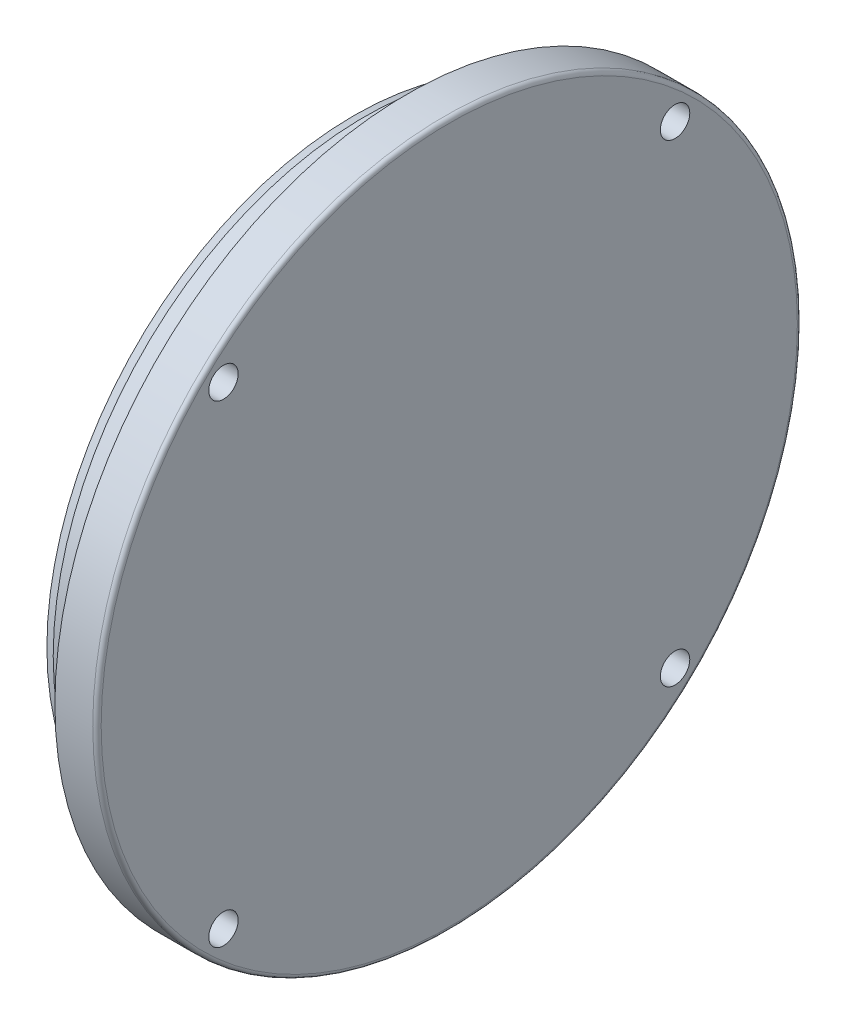
ISO-10303-21;
HEADER;
FILE_DESCRIPTION(('STEP AP214'),'2;1');
FILE_NAME('part.step','',(''),(''),'','','');
FILE_SCHEMA(('AUTOMOTIVE_DESIGN { 1 0 10303 214 1 1 1 1 }'));
ENDSEC;
DATA;
#1=APPLICATION_CONTEXT('core data for automotive mechanical design processes');
#2=APPLICATION_PROTOCOL_DEFINITION('international standard','automotive_design',2000,#1);
#3=PRODUCT_CONTEXT('',#1,'mechanical');
#4=PRODUCT('Part','Part','',(#3));
#5=PRODUCT_RELATED_PRODUCT_CATEGORY('part','',(#4));
#6=PRODUCT_DEFINITION_FORMATION('','',#4);
#7=PRODUCT_DEFINITION_CONTEXT('part definition',#1,'design');
#8=PRODUCT_DEFINITION('design','',#6,#7);
#9=PRODUCT_DEFINITION_SHAPE('','',#8);
#10=(LENGTH_UNIT() NAMED_UNIT(*) SI_UNIT(.MILLI.,.METRE.));
#11=(NAMED_UNIT(*) PLANE_ANGLE_UNIT() SI_UNIT($,.RADIAN.));
#12=(NAMED_UNIT(*) SI_UNIT($,.STERADIAN.) SOLID_ANGLE_UNIT());
#13=UNCERTAINTY_MEASURE_WITH_UNIT(LENGTH_MEASURE(1.E-05),#10,'distance_accuracy_value','');
#14=(GEOMETRIC_REPRESENTATION_CONTEXT(3) GLOBAL_UNCERTAINTY_ASSIGNED_CONTEXT((#13)) GLOBAL_UNIT_ASSIGNED_CONTEXT((#10,
#11,#12)) REPRESENTATION_CONTEXT('',''));
#15=CARTESIAN_POINT('',(0.,0.,0.));
#16=DIRECTION('',(0.,0.,1.));
#17=DIRECTION('',(1.,0.,0.));
#18=AXIS2_PLACEMENT_3D('',#15,#16,#17);
#19=CARTESIAN_POINT('',(13.9862915010152,112.5,107.349895202557));
#20=DIRECTION('',(1.,0.,0.));
#21=DIRECTION('',(0.,0.,-1.));
#22=AXIS2_PLACEMENT_3D('',#19,#20,#21);
#23=CYLINDRICAL_SURFACE('',#22,4.00000000000001);
#24=CARTESIAN_POINT('',(25.3,112.5,107.349895202557));
#25=DIRECTION('',(1.,0.,0.));
#26=DIRECTION('',(0.,0.,-1.));
#27=AXIS2_PLACEMENT_3D('',#24,#25,#26);
#28=CIRCLE('',#27,4.00000000000001);
#29=CARTESIAN_POINT('',(25.3,112.5,103.349895202557));
#30=VERTEX_POINT('',#29);
#31=EDGE_CURVE('E95',#30,#30,#28,.F.);
#32=ORIENTED_EDGE('',*,*,#31,.T.);
#33=EDGE_LOOP('',(#32));
#34=FACE_BOUND('',#33,.T.);
#35=CARTESIAN_POINT('',(35.3,112.5,107.349895202557));
#36=DIRECTION('',(1.,0.,0.));
#37=DIRECTION('',(0.,0.,-1.));
#38=AXIS2_PLACEMENT_3D('',#35,#36,#37);
#39=CIRCLE('',#38,4.00000000000001);
#40=CARTESIAN_POINT('',(35.3,112.5,103.349895202557));
#41=VERTEX_POINT('',#40);
#42=EDGE_CURVE('E49',#41,#41,#39,.F.);
#43=ORIENTED_EDGE('',*,*,#42,.F.);
#44=EDGE_LOOP('',(#43));
#45=FACE_BOUND('',#44,.T.);
#46=ADVANCED_FACE('F31',(#34,#45),#23,.F.);
#47=CARTESIAN_POINT('',(13.9862915010152,112.5,-107.349895202557));
#48=DIRECTION('',(1.,0.,0.));
#49=DIRECTION('',(0.,0.,-1.));
#50=AXIS2_PLACEMENT_3D('',#47,#48,#49);
#51=CYLINDRICAL_SURFACE('',#50,4.00000000000001);
#52=CARTESIAN_POINT('',(25.3,112.5,-107.349895202557));
#53=DIRECTION('',(1.,0.,0.));
#54=DIRECTION('',(0.,0.,-1.));
#55=AXIS2_PLACEMENT_3D('',#52,#53,#54);
#56=CIRCLE('',#55,4.00000000000001);
#57=CARTESIAN_POINT('',(25.3,112.5,-111.349895202557));
#58=VERTEX_POINT('',#57);
#59=EDGE_CURVE('E98',#58,#58,#56,.F.);
#60=ORIENTED_EDGE('',*,*,#59,.T.);
#61=EDGE_LOOP('',(#60));
#62=FACE_BOUND('',#61,.T.);
#63=CARTESIAN_POINT('',(35.3,112.5,-107.349895202557));
#64=DIRECTION('',(1.,0.,0.));
#65=DIRECTION('',(0.,0.,-1.));
#66=AXIS2_PLACEMENT_3D('',#63,#64,#65);
#67=CIRCLE('',#66,4.00000000000001);
#68=CARTESIAN_POINT('',(35.3,112.5,-111.349895202557));
#69=VERTEX_POINT('',#68);
#70=EDGE_CURVE('E53',#69,#69,#67,.F.);
#71=ORIENTED_EDGE('',*,*,#70,.F.);
#72=EDGE_LOOP('',(#71));
#73=FACE_BOUND('',#72,.T.);
#74=ADVANCED_FACE('F162',(#62,#73),#51,.F.);
#75=CARTESIAN_POINT('',(13.9862915010152,-112.5,-107.349895202557));
#76=DIRECTION('',(1.,0.,0.));
#77=DIRECTION('',(0.,0.,-1.));
#78=AXIS2_PLACEMENT_3D('',#75,#76,#77);
#79=CYLINDRICAL_SURFACE('',#78,4.00000000000001);
#80=CARTESIAN_POINT('',(25.3,-112.5,-107.349895202557));
#81=DIRECTION('',(1.,0.,0.));
#82=DIRECTION('',(0.,0.,-1.));
#83=AXIS2_PLACEMENT_3D('',#80,#81,#82);
#84=CIRCLE('',#83,4.00000000000001);
#85=CARTESIAN_POINT('',(25.3,-112.5,-111.349895202557));
#86=VERTEX_POINT('',#85);
#87=EDGE_CURVE('E101',#86,#86,#84,.F.);
#88=ORIENTED_EDGE('',*,*,#87,.T.);
#89=EDGE_LOOP('',(#88));
#90=FACE_BOUND('',#89,.T.);
#91=CARTESIAN_POINT('',(35.3,-112.5,-107.349895202557));
#92=DIRECTION('',(1.,0.,0.));
#93=DIRECTION('',(0.,0.,-1.));
#94=AXIS2_PLACEMENT_3D('',#91,#92,#93);
#95=CIRCLE('',#94,4.00000000000001);
#96=CARTESIAN_POINT('',(35.3,-112.5,-111.349895202557));
#97=VERTEX_POINT('',#96);
#98=EDGE_CURVE('E56',#97,#97,#95,.F.);
#99=ORIENTED_EDGE('',*,*,#98,.F.);
#100=EDGE_LOOP('',(#99));
#101=FACE_BOUND('',#100,.T.);
#102=ADVANCED_FACE('F168',(#90,#101),#79,.F.);
#103=CARTESIAN_POINT('',(13.9862915010152,-112.5,107.349895202557));
#104=DIRECTION('',(1.,0.,0.));
#105=DIRECTION('',(0.,0.,-1.));
#106=AXIS2_PLACEMENT_3D('',#103,#104,#105);
#107=CYLINDRICAL_SURFACE('',#106,4.00000000000001);
#108=CARTESIAN_POINT('',(25.3,-112.5,107.349895202557));
#109=DIRECTION('',(1.,0.,0.));
#110=DIRECTION('',(0.,0.,-1.));
#111=AXIS2_PLACEMENT_3D('',#108,#109,#110);
#112=CIRCLE('',#111,4.00000000000001);
#113=CARTESIAN_POINT('',(25.3,-112.5,103.349895202557));
#114=VERTEX_POINT('',#113);
#115=EDGE_CURVE('E52',#114,#114,#112,.F.);
#116=ORIENTED_EDGE('',*,*,#115,.T.);
#117=EDGE_LOOP('',(#116));
#118=FACE_BOUND('',#117,.T.);
#119=CARTESIAN_POINT('',(35.3,-112.5,107.349895202557));
#120=DIRECTION('',(1.,0.,0.));
#121=DIRECTION('',(0.,0.,-1.));
#122=AXIS2_PLACEMENT_3D('',#119,#120,#121);
#123=CIRCLE('',#122,4.00000000000001);
#124=CARTESIAN_POINT('',(35.3,-112.5,103.349895202557));
#125=VERTEX_POINT('',#124);
#126=EDGE_CURVE('E59',#125,#125,#123,.F.);
#127=ORIENTED_EDGE('',*,*,#126,.F.);
#128=EDGE_LOOP('',(#127));
#129=FACE_BOUND('',#128,.T.);
#130=ADVANCED_FACE('F173',(#118,#129),#107,.F.);
#131=CARTESIAN_POINT('',(5.,32.75,0.));
#132=DIRECTION('',(-1.,0.,0.));
#133=DIRECTION('',(0.,0.,1.));
#134=AXIS2_PLACEMENT_3D('',#131,#132,#133);
#135=PLANE('',#134);
#136=CARTESIAN_POINT('',(5.,0.,0.));
#137=DIRECTION('',(-1.,0.,0.));
#138=DIRECTION('',(0.,0.,1.));
#139=AXIS2_PLACEMENT_3D('',#136,#137,#138);
#140=CIRCLE('',#139,32.75);
#141=CARTESIAN_POINT('',(5.,0.,32.75));
#142=VERTEX_POINT('',#141);
#143=EDGE_CURVE('E42',#142,#142,#140,.T.);
#144=ORIENTED_EDGE('',*,*,#143,.F.);
#145=EDGE_LOOP('',(#144));
#146=FACE_BOUND('',#145,.T.);
#147=CARTESIAN_POINT('',(5.,0.,0.));
#148=DIRECTION('',(-1.,0.,0.));
#149=DIRECTION('',(0.,0.,1.));
#150=AXIS2_PLACEMENT_3D('',#147,#148,#149);
#151=CIRCLE('',#150,31.);
#152=CARTESIAN_POINT('',(5.,0.,31.));
#153=VERTEX_POINT('',#152);
#154=EDGE_CURVE('E92',#153,#153,#151,.T.);
#155=ORIENTED_EDGE('',*,*,#154,.T.);
#156=EDGE_LOOP('',(#155));
#157=FACE_BOUND('',#156,.T.);
#158=ADVANCED_FACE('F219',(#146,#157),#135,.F.);
#159=CARTESIAN_POINT('',(0.,0.,0.));
#160=DIRECTION('',(-1.,0.,0.));
#161=DIRECTION('',(0.,0.,1.));
#162=AXIS2_PLACEMENT_3D('',#159,#160,#161);
#163=CYLINDRICAL_SURFACE('',#162,32.75);
#164=CARTESIAN_POINT('',(7.3,0.,0.));
#165=DIRECTION('',(-1.,0.,0.));
#166=DIRECTION('',(0.,0.,1.));
#167=AXIS2_PLACEMENT_3D('',#164,#165,#166);
#168=CIRCLE('',#167,32.75);
#169=CARTESIAN_POINT('',(7.3,0.,32.75));
#170=VERTEX_POINT('',#169);
#171=EDGE_CURVE('E46',#170,#170,#168,.T.);
#172=ORIENTED_EDGE('',*,*,#171,.F.);
#173=EDGE_LOOP('',(#172));
#174=FACE_BOUND('',#173,.T.);
#175=ORIENTED_EDGE('',*,*,#143,.T.);
#176=EDGE_LOOP('',(#175));
#177=FACE_BOUND('',#176,.T.);
#178=ADVANCED_FACE('F216',(#174,#177),#163,.F.);
#179=CARTESIAN_POINT('',(7.3,32.75,0.));
#180=DIRECTION('',(1.,0.,0.));
#181=DIRECTION('',(0.,0.,-1.));
#182=AXIS2_PLACEMENT_3D('',#179,#180,#181);
#183=PLANE('',#182);
#184=CARTESIAN_POINT('',(7.3,0.,0.));
#185=DIRECTION('',(-1.,0.,0.));
#186=DIRECTION('',(0.,0.,1.));
#187=AXIS2_PLACEMENT_3D('',#184,#185,#186);
#188=CIRCLE('',#187,31.);
#189=CARTESIAN_POINT('',(7.3,0.,31.));
#190=VERTEX_POINT('',#189);
#191=EDGE_CURVE('E65',#190,#190,#188,.T.);
#192=ORIENTED_EDGE('',*,*,#191,.F.);
#193=EDGE_LOOP('',(#192));
#194=FACE_BOUND('',#193,.T.);
#195=ORIENTED_EDGE('',*,*,#171,.T.);
#196=EDGE_LOOP('',(#195));
#197=FACE_BOUND('',#196,.T.);
#198=ADVANCED_FACE('F212',(#194,#197),#183,.F.);
#199=CARTESIAN_POINT('',(0.,0.,0.));
#200=DIRECTION('',(-1.,0.,0.));
#201=DIRECTION('',(0.,0.,1.));
#202=AXIS2_PLACEMENT_3D('',#199,#200,#201);
#203=CYLINDRICAL_SURFACE('',#202,31.);
#204=CARTESIAN_POINT('',(25.3,0.,0.));
#205=DIRECTION('',(-1.,0.,0.));
#206=DIRECTION('',(0.,0.,1.));
#207=AXIS2_PLACEMENT_3D('',#204,#205,#206);
#208=CIRCLE('',#207,31.);
#209=CARTESIAN_POINT('',(25.3,0.,31.));
#210=VERTEX_POINT('',#209);
#211=EDGE_CURVE('E68',#210,#210,#208,.T.);
#212=ORIENTED_EDGE('',*,*,#211,.F.);
#213=EDGE_LOOP('',(#212));
#214=FACE_BOUND('',#213,.T.);
#215=ORIENTED_EDGE('',*,*,#191,.T.);
#216=EDGE_LOOP('',(#215));
#217=FACE_BOUND('',#216,.T.);
#218=ADVANCED_FACE('F208',(#214,#217),#203,.F.);
#219=CARTESIAN_POINT('',(25.3,31.,0.));
#220=DIRECTION('',(1.,0.,0.));
#221=DIRECTION('',(0.,0.,-1.));
#222=AXIS2_PLACEMENT_3D('',#219,#220,#221);
#223=PLANE('',#222);
#224=CARTESIAN_POINT('',(25.3,0.,0.));
#225=DIRECTION('',(-1.,0.,0.));
#226=DIRECTION('',(0.,0.,1.));
#227=AXIS2_PLACEMENT_3D('',#224,#225,#226);
#228=CIRCLE('',#227,16.);
#229=CARTESIAN_POINT('',(25.3,0.,16.));
#230=VERTEX_POINT('',#229);
#231=EDGE_CURVE('E71',#230,#230,#228,.T.);
#232=ORIENTED_EDGE('',*,*,#231,.F.);
#233=EDGE_LOOP('',(#232));
#234=FACE_BOUND('',#233,.T.);
#235=ORIENTED_EDGE('',*,*,#211,.T.);
#236=EDGE_LOOP('',(#235));
#237=FACE_BOUND('',#236,.T.);
#238=ADVANCED_FACE('F204',(#234,#237),#223,.F.);
#239=CARTESIAN_POINT('',(0.,0.,0.));
#240=DIRECTION('',(-1.,0.,0.));
#241=DIRECTION('',(0.,0.,1.));
#242=AXIS2_PLACEMENT_3D('',#239,#240,#241);
#243=CYLINDRICAL_SURFACE('',#242,16.);
#244=CARTESIAN_POINT('',(35.3,0.,0.));
#245=DIRECTION('',(-1.,0.,0.));
#246=DIRECTION('',(0.,0.,1.));
#247=AXIS2_PLACEMENT_3D('',#244,#245,#246);
#248=CIRCLE('',#247,16.);
#249=CARTESIAN_POINT('',(35.3,0.,16.));
#250=VERTEX_POINT('',#249);
#251=EDGE_CURVE('E74',#250,#250,#248,.T.);
#252=ORIENTED_EDGE('',*,*,#251,.F.);
#253=EDGE_LOOP('',(#252));
#254=FACE_BOUND('',#253,.T.);
#255=ORIENTED_EDGE('',*,*,#231,.T.);
#256=EDGE_LOOP('',(#255));
#257=FACE_BOUND('',#256,.T.);
#258=ADVANCED_FACE('F200',(#254,#257),#243,.F.);
#259=CARTESIAN_POINT('',(35.3,16.,0.));
#260=DIRECTION('',(1.,0.,0.));
#261=DIRECTION('',(0.,0.,-1.));
#262=AXIS2_PLACEMENT_3D('',#259,#260,#261);
#263=PLANE('',#262);
#264=ORIENTED_EDGE('',*,*,#251,.T.);
#265=EDGE_LOOP('',(#264));
#266=FACE_BOUND('',#265,.T.);
#267=ADVANCED_FACE('F144',(#266),#263,.F.);
#268=CARTESIAN_POINT('',(45.3,161.,0.));
#269=DIRECTION('',(-1.,0.,0.));
#270=DIRECTION('',(0.,0.,1.));
#271=AXIS2_PLACEMENT_3D('',#268,#269,#270);
#272=PLANE('',#271);
#273=CARTESIAN_POINT('',(45.3,0.,0.));
#274=DIRECTION('',(-1.,0.,0.));
#275=DIRECTION('',(0.,0.,1.));
#276=AXIS2_PLACEMENT_3D('',#273,#274,#275);
#277=CIRCLE('',#276,165.5);
#278=CARTESIAN_POINT('',(45.3,0.,165.5));
#279=VERTEX_POINT('',#278);
#280=EDGE_CURVE('E10',#279,#279,#277,.F.);
#281=ORIENTED_EDGE('',*,*,#280,.T.);
#282=EDGE_LOOP('',(#281));
#283=FACE_BOUND('',#282,.T.);
#284=CARTESIAN_POINT('',(45.3,-112.5,107.349895202557));
#285=DIRECTION('',(1.,0.,0.));
#286=DIRECTION('',(0.,0.,-1.));
#287=AXIS2_PLACEMENT_3D('',#284,#285,#286);
#288=CIRCLE('',#287,7.);
#289=CARTESIAN_POINT('',(45.3,-112.5,100.349895202557));
#290=VERTEX_POINT('',#289);
#291=EDGE_CURVE('E112',#290,#290,#288,.T.);
#292=ORIENTED_EDGE('',*,*,#291,.F.);
#293=EDGE_LOOP('',(#292));
#294=FACE_BOUND('',#293,.T.);
#295=CARTESIAN_POINT('',(45.3,-112.5,-107.349895202557));
#296=DIRECTION('',(1.,0.,0.));
#297=DIRECTION('',(0.,0.,-1.));
#298=AXIS2_PLACEMENT_3D('',#295,#296,#297);
#299=CIRCLE('',#298,7.);
#300=CARTESIAN_POINT('',(45.3,-112.5,-114.349895202557));
#301=VERTEX_POINT('',#300);
#302=EDGE_CURVE('E118',#301,#301,#299,.T.);
#303=ORIENTED_EDGE('',*,*,#302,.F.);
#304=EDGE_LOOP('',(#303));
#305=FACE_BOUND('',#304,.T.);
#306=CARTESIAN_POINT('',(45.3,112.5,-107.349895202557));
#307=DIRECTION('',(1.,0.,0.));
#308=DIRECTION('',(0.,0.,-1.));
#309=AXIS2_PLACEMENT_3D('',#306,#307,#308);
#310=CIRCLE('',#309,7.);
#311=CARTESIAN_POINT('',(45.3,112.5,-114.349895202557));
#312=VERTEX_POINT('',#311);
#313=EDGE_CURVE('E124',#312,#312,#310,.T.);
#314=ORIENTED_EDGE('',*,*,#313,.F.);
#315=EDGE_LOOP('',(#314));
#316=FACE_BOUND('',#315,.T.);
#317=CARTESIAN_POINT('',(45.3,112.5,107.349895202557));
#318=DIRECTION('',(1.,0.,0.));
#319=DIRECTION('',(0.,0.,-1.));
#320=AXIS2_PLACEMENT_3D('',#317,#318,#319);
#321=CIRCLE('',#320,7.);
#322=CARTESIAN_POINT('',(45.3,112.5,100.349895202557));
#323=VERTEX_POINT('',#322);
#324=EDGE_CURVE('E106',#323,#323,#321,.T.);
#325=ORIENTED_EDGE('',*,*,#324,.F.);
#326=EDGE_LOOP('',(#325));
#327=FACE_BOUND('',#326,.T.);
#328=ADVANCED_FACE('F140',(#283,#294,#305,#316,#327),#272,.F.);
#329=CARTESIAN_POINT('',(0.,0.,0.));
#330=DIRECTION('',(-1.,0.,0.));
#331=DIRECTION('',(0.,0.,1.));
#332=AXIS2_PLACEMENT_3D('',#329,#330,#331);
#333=CYLINDRICAL_SURFACE('',#332,167.5);
#334=CARTESIAN_POINT('',(43.3,0.,0.));
#335=DIRECTION('',(-1.,0.,0.));
#336=DIRECTION('',(0.,0.,1.));
#337=AXIS2_PLACEMENT_3D('',#334,#335,#336);
#338=CIRCLE('',#337,167.5);
#339=CARTESIAN_POINT('',(43.3,0.,167.5));
#340=VERTEX_POINT('',#339);
#341=EDGE_CURVE('E38',#340,#340,#338,.T.);
#342=ORIENTED_EDGE('',*,*,#341,.T.);
#343=EDGE_LOOP('',(#342));
#344=FACE_BOUND('',#343,.T.);
#345=CARTESIAN_POINT('',(25.3,0.,0.));
#346=DIRECTION('',(-1.,0.,0.));
#347=DIRECTION('',(0.,0.,1.));
#348=AXIS2_PLACEMENT_3D('',#345,#346,#347);
#349=CIRCLE('',#348,167.5);
#350=CARTESIAN_POINT('',(25.3,0.,167.5));
#351=VERTEX_POINT('',#350);
#352=EDGE_CURVE('E77',#351,#351,#349,.T.);
#353=ORIENTED_EDGE('',*,*,#352,.F.);
#354=EDGE_LOOP('',(#353));
#355=FACE_BOUND('',#354,.T.);
#356=ADVANCED_FACE('F143',(#344,#355),#333,.T.);
#357=CARTESIAN_POINT('',(25.3,167.5,0.));
#358=DIRECTION('',(1.,0.,0.));
#359=DIRECTION('',(0.,0.,-1.));
#360=AXIS2_PLACEMENT_3D('',#357,#358,#359);
#361=PLANE('',#360);
#362=ORIENTED_EDGE('',*,*,#115,.F.);
#363=EDGE_LOOP('',(#362));
#364=FACE_BOUND('',#363,.T.);
#365=ORIENTED_EDGE('',*,*,#87,.F.);
#366=EDGE_LOOP('',(#365));
#367=FACE_BOUND('',#366,.T.);
#368=ORIENTED_EDGE('',*,*,#59,.F.);
#369=EDGE_LOOP('',(#368));
#370=FACE_BOUND('',#369,.T.);
#371=ORIENTED_EDGE('',*,*,#31,.F.);
#372=EDGE_LOOP('',(#371));
#373=FACE_BOUND('',#372,.T.);
#374=CARTESIAN_POINT('',(25.3,0.,0.));
#375=DIRECTION('',(-1.,0.,0.));
#376=DIRECTION('',(0.,0.,1.));
#377=AXIS2_PLACEMENT_3D('',#374,#375,#376);
#378=CIRCLE('',#377,148.);
#379=CARTESIAN_POINT('',(25.3,0.,148.));
#380=VERTEX_POINT('',#379);
#381=EDGE_CURVE('E80',#380,#380,#378,.T.);
#382=ORIENTED_EDGE('',*,*,#381,.F.);
#383=EDGE_LOOP('',(#382));
#384=FACE_BOUND('',#383,.T.);
#385=ORIENTED_EDGE('',*,*,#352,.T.);
#386=EDGE_LOOP('',(#385));
#387=FACE_BOUND('',#386,.T.);
#388=ADVANCED_FACE('F191',(#364,#367,#370,#373,#384,#387),#361,.F.);
#389=CARTESIAN_POINT('',(0.,0.,0.));
#390=DIRECTION('',(-1.,0.,0.));
#391=DIRECTION('',(0.,0.,1.));
#392=AXIS2_PLACEMENT_3D('',#389,#390,#391);
#393=CYLINDRICAL_SURFACE('',#392,148.);
#394=CARTESIAN_POINT('',(5.,0.,0.));
#395=DIRECTION('',(-1.,0.,0.));
#396=DIRECTION('',(0.,0.,1.));
#397=AXIS2_PLACEMENT_3D('',#394,#395,#396);
#398=CIRCLE('',#397,148.);
#399=CARTESIAN_POINT('',(5.,0.,148.));
#400=VERTEX_POINT('',#399);
#401=EDGE_CURVE('E83',#400,#400,#398,.T.);
#402=ORIENTED_EDGE('',*,*,#401,.F.);
#403=EDGE_LOOP('',(#402));
#404=FACE_BOUND('',#403,.T.);
#405=ORIENTED_EDGE('',*,*,#381,.T.);
#406=EDGE_LOOP('',(#405));
#407=FACE_BOUND('',#406,.T.);
#408=ADVANCED_FACE('F187',(#404,#407),#393,.T.);
#409=CARTESIAN_POINT('',(5.,0.,0.));
#410=DIRECTION('',(1.,0.,0.));
#411=DIRECTION('',(0.,0.,-1.));
#412=AXIS2_PLACEMENT_3D('',#409,#410,#411);
#413=CONICAL_SURFACE('',#412,148.,0.380506377112365);
#414=CARTESIAN_POINT('',(0.,0.,0.));
#415=DIRECTION('',(-1.,0.,0.));
#416=DIRECTION('',(0.,0.,1.));
#417=AXIS2_PLACEMENT_3D('',#414,#415,#416);
#418=CIRCLE('',#417,146.);
#419=CARTESIAN_POINT('',(0.,0.,146.));
#420=VERTEX_POINT('',#419);
#421=EDGE_CURVE('E86',#420,#420,#418,.T.);
#422=ORIENTED_EDGE('',*,*,#421,.F.);
#423=EDGE_LOOP('',(#422));
#424=FACE_BOUND('',#423,.T.);
#425=ORIENTED_EDGE('',*,*,#401,.T.);
#426=EDGE_LOOP('',(#425));
#427=FACE_BOUND('',#426,.T.);
#428=ADVANCED_FACE('F183',(#424,#427),#413,.T.);
#429=CARTESIAN_POINT('',(0.,31.,0.));
#430=DIRECTION('',(1.,0.,0.));
#431=DIRECTION('',(0.,0.,-1.));
#432=AXIS2_PLACEMENT_3D('',#429,#430,#431);
#433=PLANE('',#432);
#434=CARTESIAN_POINT('',(0.,0.,0.));
#435=DIRECTION('',(-1.,0.,0.));
#436=DIRECTION('',(0.,0.,1.));
#437=AXIS2_PLACEMENT_3D('',#434,#435,#436);
#438=CIRCLE('',#437,31.);
#439=CARTESIAN_POINT('',(0.,0.,31.));
#440=VERTEX_POINT('',#439);
#441=EDGE_CURVE('E89',#440,#440,#438,.T.);
#442=ORIENTED_EDGE('',*,*,#441,.F.);
#443=EDGE_LOOP('',(#442));
#444=FACE_BOUND('',#443,.T.);
#445=ORIENTED_EDGE('',*,*,#421,.T.);
#446=EDGE_LOOP('',(#445));
#447=FACE_BOUND('',#446,.T.);
#448=ADVANCED_FACE('F179',(#444,#447),#433,.F.);
#449=CARTESIAN_POINT('',(0.,0.,0.));
#450=DIRECTION('',(-1.,0.,0.));
#451=DIRECTION('',(0.,0.,1.));
#452=AXIS2_PLACEMENT_3D('',#449,#450,#451);
#453=CYLINDRICAL_SURFACE('',#452,31.);
#454=ORIENTED_EDGE('',*,*,#154,.F.);
#455=EDGE_LOOP('',(#454));
#456=FACE_BOUND('',#455,.T.);
#457=ORIENTED_EDGE('',*,*,#441,.T.);
#458=EDGE_LOOP('',(#457));
#459=FACE_BOUND('',#458,.T.);
#460=ADVANCED_FACE('F175',(#456,#459),#453,.F.);
#461=CARTESIAN_POINT('',(35.3,-112.5,107.349895202557));
#462=DIRECTION('',(1.,0.,0.));
#463=DIRECTION('',(0.,0.,-1.));
#464=AXIS2_PLACEMENT_3D('',#461,#462,#463);
#465=PLANE('',#464);
#466=CARTESIAN_POINT('',(35.3,-112.5,107.349895202557));
#467=DIRECTION('',(1.,0.,0.));
#468=DIRECTION('',(0.,0.,-1.));
#469=AXIS2_PLACEMENT_3D('',#466,#467,#468);
#470=CIRCLE('',#469,7.);
#471=CARTESIAN_POINT('',(35.3,-112.5,100.349895202557));
#472=VERTEX_POINT('',#471);
#473=EDGE_CURVE('E115',#472,#472,#470,.T.);
#474=ORIENTED_EDGE('',*,*,#473,.T.);
#475=EDGE_LOOP('',(#474));
#476=FACE_BOUND('',#475,.T.);
#477=ORIENTED_EDGE('',*,*,#126,.T.);
#478=EDGE_LOOP('',(#477));
#479=FACE_BOUND('',#478,.T.);
#480=ADVANCED_FACE('F178',(#476,#479),#465,.T.);
#481=CARTESIAN_POINT('',(35.3,-112.5,107.349895202557));
#482=DIRECTION('',(1.,0.,0.));
#483=DIRECTION('',(0.,0.,-1.));
#484=AXIS2_PLACEMENT_3D('',#481,#482,#483);
#485=CYLINDRICAL_SURFACE('',#484,7.);
#486=ORIENTED_EDGE('',*,*,#473,.F.);
#487=EDGE_LOOP('',(#486));
#488=FACE_BOUND('',#487,.T.);
#489=ORIENTED_EDGE('',*,*,#291,.T.);
#490=EDGE_LOOP('',(#489));
#491=FACE_BOUND('',#490,.T.);
#492=ADVANCED_FACE('F252',(#488,#491),#485,.F.);
#493=CARTESIAN_POINT('',(35.3,-112.5,-107.349895202557));
#494=DIRECTION('',(1.,0.,0.));
#495=DIRECTION('',(0.,0.,-1.));
#496=AXIS2_PLACEMENT_3D('',#493,#494,#495);
#497=PLANE('',#496);
#498=CARTESIAN_POINT('',(35.3,-112.5,-107.349895202557));
#499=DIRECTION('',(1.,0.,0.));
#500=DIRECTION('',(0.,0.,-1.));
#501=AXIS2_PLACEMENT_3D('',#498,#499,#500);
#502=CIRCLE('',#501,7.);
#503=CARTESIAN_POINT('',(35.3,-112.5,-114.349895202557));
#504=VERTEX_POINT('',#503);
#505=EDGE_CURVE('E121',#504,#504,#502,.T.);
#506=ORIENTED_EDGE('',*,*,#505,.T.);
#507=EDGE_LOOP('',(#506));
#508=FACE_BOUND('',#507,.T.);
#509=ORIENTED_EDGE('',*,*,#98,.T.);
#510=EDGE_LOOP('',(#509));
#511=FACE_BOUND('',#510,.T.);
#512=ADVANCED_FACE('F258',(#508,#511),#497,.T.);
#513=CARTESIAN_POINT('',(35.3,-112.5,-107.349895202557));
#514=DIRECTION('',(1.,0.,0.));
#515=DIRECTION('',(0.,0.,-1.));
#516=AXIS2_PLACEMENT_3D('',#513,#514,#515);
#517=CYLINDRICAL_SURFACE('',#516,7.);
#518=ORIENTED_EDGE('',*,*,#505,.F.);
#519=EDGE_LOOP('',(#518));
#520=FACE_BOUND('',#519,.T.);
#521=ORIENTED_EDGE('',*,*,#302,.T.);
#522=EDGE_LOOP('',(#521));
#523=FACE_BOUND('',#522,.T.);
#524=ADVANCED_FACE('F262',(#520,#523),#517,.F.);
#525=CARTESIAN_POINT('',(35.3,112.5,-107.349895202557));
#526=DIRECTION('',(1.,0.,0.));
#527=DIRECTION('',(0.,0.,-1.));
#528=AXIS2_PLACEMENT_3D('',#525,#526,#527);
#529=PLANE('',#528);
#530=CARTESIAN_POINT('',(35.3,112.5,-107.349895202557));
#531=DIRECTION('',(1.,0.,0.));
#532=DIRECTION('',(0.,0.,-1.));
#533=AXIS2_PLACEMENT_3D('',#530,#531,#532);
#534=CIRCLE('',#533,7.);
#535=CARTESIAN_POINT('',(35.3,112.5,-114.349895202557));
#536=VERTEX_POINT('',#535);
#537=EDGE_CURVE('E109',#536,#536,#534,.T.);
#538=ORIENTED_EDGE('',*,*,#537,.T.);
#539=EDGE_LOOP('',(#538));
#540=FACE_BOUND('',#539,.T.);
#541=ORIENTED_EDGE('',*,*,#70,.T.);
#542=EDGE_LOOP('',(#541));
#543=FACE_BOUND('',#542,.T.);
#544=ADVANCED_FACE('F130',(#540,#543),#529,.T.);
#545=CARTESIAN_POINT('',(35.3,112.5,-107.349895202557));
#546=DIRECTION('',(1.,0.,0.));
#547=DIRECTION('',(0.,0.,-1.));
#548=AXIS2_PLACEMENT_3D('',#545,#546,#547);
#549=CYLINDRICAL_SURFACE('',#548,7.);
#550=ORIENTED_EDGE('',*,*,#537,.F.);
#551=EDGE_LOOP('',(#550));
#552=FACE_BOUND('',#551,.T.);
#553=ORIENTED_EDGE('',*,*,#313,.T.);
#554=EDGE_LOOP('',(#553));
#555=FACE_BOUND('',#554,.T.);
#556=ADVANCED_FACE('F133',(#552,#555),#549,.F.);
#557=CARTESIAN_POINT('',(35.3,112.5,107.349895202557));
#558=DIRECTION('',(1.,0.,0.));
#559=DIRECTION('',(0.,0.,-1.));
#560=AXIS2_PLACEMENT_3D('',#557,#558,#559);
#561=PLANE('',#560);
#562=CARTESIAN_POINT('',(35.3,112.5,107.349895202557));
#563=DIRECTION('',(1.,0.,0.));
#564=DIRECTION('',(0.,0.,-1.));
#565=AXIS2_PLACEMENT_3D('',#562,#563,#564);
#566=CIRCLE('',#565,7.);
#567=CARTESIAN_POINT('',(35.3,112.5,100.349895202557));
#568=VERTEX_POINT('',#567);
#569=EDGE_CURVE('E61',#568,#568,#566,.T.);
#570=ORIENTED_EDGE('',*,*,#569,.T.);
#571=EDGE_LOOP('',(#570));
#572=FACE_BOUND('',#571,.T.);
#573=ORIENTED_EDGE('',*,*,#42,.T.);
#574=EDGE_LOOP('',(#573));
#575=FACE_BOUND('',#574,.T.);
#576=ADVANCED_FACE('F136',(#572,#575),#561,.T.);
#577=CARTESIAN_POINT('',(35.3,112.5,107.349895202557));
#578=DIRECTION('',(1.,0.,0.));
#579=DIRECTION('',(0.,0.,-1.));
#580=AXIS2_PLACEMENT_3D('',#577,#578,#579);
#581=CYLINDRICAL_SURFACE('',#580,7.);
#582=ORIENTED_EDGE('',*,*,#569,.F.);
#583=EDGE_LOOP('',(#582));
#584=FACE_BOUND('',#583,.T.);
#585=ORIENTED_EDGE('',*,*,#324,.T.);
#586=EDGE_LOOP('',(#585));
#587=FACE_BOUND('',#586,.T.);
#588=ADVANCED_FACE('F148',(#584,#587),#581,.F.);
#589=CARTESIAN_POINT('',(43.3,0.,0.));
#590=DIRECTION('',(-1.,0.,0.));
#591=DIRECTION('',(0.,0.,1.));
#592=AXIS2_PLACEMENT_3D('',#589,#590,#591);
#593=TOROIDAL_SURFACE('',#592,165.5,2.);
#594=ORIENTED_EDGE('',*,*,#280,.F.);
#595=EDGE_LOOP('',(#594));
#596=FACE_BOUND('',#595,.T.);
#597=ORIENTED_EDGE('',*,*,#341,.F.);
#598=EDGE_LOOP('',(#597));
#599=FACE_BOUND('',#598,.T.);
#600=ADVANCED_FACE('F33',(#596,#599),#593,.T.);
#601=CLOSED_SHELL('',(#46,#74,#102,#130,#158,#178,#198,#218,#238,#258,#267,#328,#356,#388,#408,
#428,#448,#460,#480,#492,#512,#524,#544,#556,#576,#588,#600));
#602=MANIFOLD_SOLID_BREP('B2',#601);
#603=ADVANCED_BREP_SHAPE_REPRESENTATION('',(#18,#602),#14);
#604=SHAPE_DEFINITION_REPRESENTATION(#9,#603);
ENDSEC;
END-ISO-10303-21;
